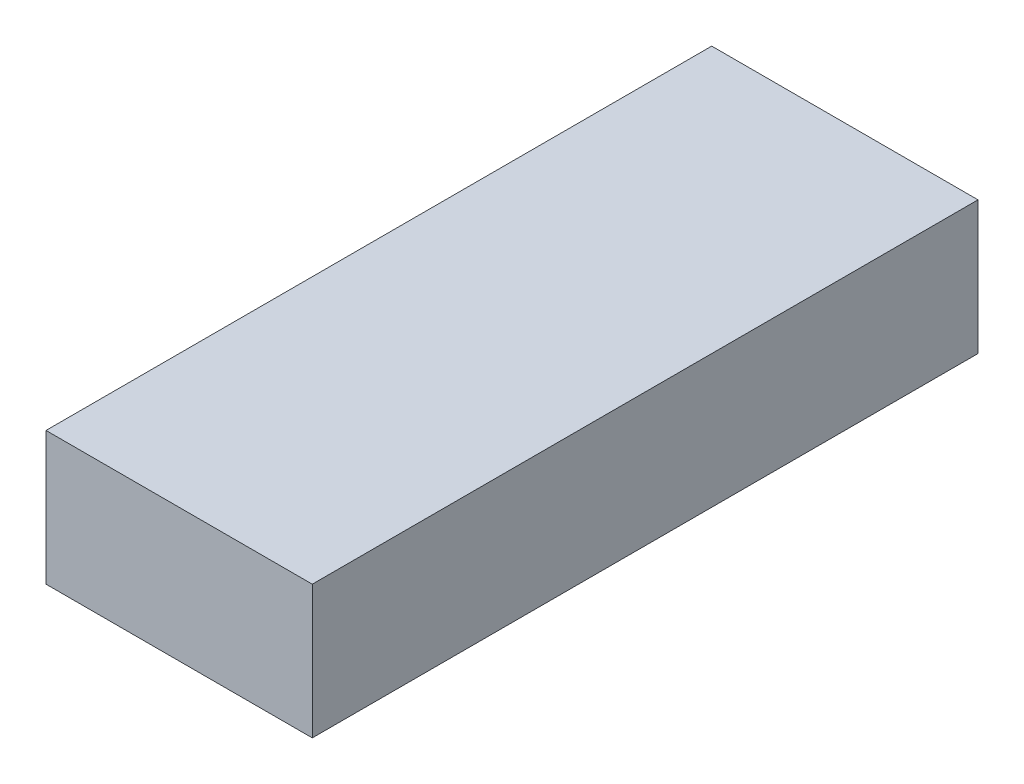
ISO-10303-21;
HEADER;
FILE_DESCRIPTION(('STEP AP214'),'2;1');
FILE_NAME('part.step','',(''),(''),'','','');
FILE_SCHEMA(('AUTOMOTIVE_DESIGN { 1 0 10303 214 1 1 1 1 }'));
ENDSEC;
DATA;
#1=APPLICATION_CONTEXT('core data for automotive mechanical design processes');
#2=APPLICATION_PROTOCOL_DEFINITION('international standard','automotive_design',2000,#1);
#3=PRODUCT_CONTEXT('',#1,'mechanical');
#4=PRODUCT('Part','Part','',(#3));
#5=PRODUCT_RELATED_PRODUCT_CATEGORY('part','',(#4));
#6=PRODUCT_DEFINITION_FORMATION('','',#4);
#7=PRODUCT_DEFINITION_CONTEXT('part definition',#1,'design');
#8=PRODUCT_DEFINITION('design','',#6,#7);
#9=PRODUCT_DEFINITION_SHAPE('','',#8);
#10=(LENGTH_UNIT() NAMED_UNIT(*) SI_UNIT(.MILLI.,.METRE.));
#11=(NAMED_UNIT(*) PLANE_ANGLE_UNIT() SI_UNIT($,.RADIAN.));
#12=(NAMED_UNIT(*) SI_UNIT($,.STERADIAN.) SOLID_ANGLE_UNIT());
#13=UNCERTAINTY_MEASURE_WITH_UNIT(LENGTH_MEASURE(1.E-05),#10,'distance_accuracy_value','');
#14=(GEOMETRIC_REPRESENTATION_CONTEXT(3) GLOBAL_UNCERTAINTY_ASSIGNED_CONTEXT((#13)) GLOBAL_UNIT_ASSIGNED_CONTEXT((#10,
#11,#12)) REPRESENTATION_CONTEXT('',''));
#15=CARTESIAN_POINT('',(0.,0.,0.));
#16=DIRECTION('',(0.,0.,1.));
#17=DIRECTION('',(1.,0.,0.));
#18=AXIS2_PLACEMENT_3D('',#15,#16,#17);
#19=CARTESIAN_POINT('',(-3.,-1.5,7.5));
#20=DIRECTION('',(1.,0.,0.));
#21=DIRECTION('',(0.,0.,-1.));
#22=AXIS2_PLACEMENT_3D('',#19,#20,#21);
#23=PLANE('',#22);
#24=DIRECTION('',(0.,-1.,0.));
#25=VECTOR('',#24,1.);
#26=CARTESIAN_POINT('',(-3.,-1.5,-7.5));
#27=LINE('',#26,#25);
#28=CARTESIAN_POINT('',(-3.,1.5,-7.5));
#29=VERTEX_POINT('',#28);
#30=CARTESIAN_POINT('',(-3.,-1.5,-7.5));
#31=VERTEX_POINT('',#30);
#32=EDGE_CURVE('E98',#29,#31,#27,.T.);
#33=ORIENTED_EDGE('',*,*,#32,.T.);
#34=DIRECTION('',(0.,0.,-1.));
#35=VECTOR('',#34,1.);
#36=CARTESIAN_POINT('',(-3.,-1.5,7.5));
#37=LINE('',#36,#35);
#38=CARTESIAN_POINT('',(-3.,-1.5,7.5));
#39=VERTEX_POINT('',#38);
#40=EDGE_CURVE('E11',#39,#31,#37,.T.);
#41=ORIENTED_EDGE('',*,*,#40,.F.);
#42=DIRECTION('',(0.,-1.,0.));
#43=VECTOR('',#42,1.);
#44=CARTESIAN_POINT('',(-3.,-1.5,7.5));
#45=LINE('',#44,#43);
#46=CARTESIAN_POINT('',(-3.,1.5,7.5));
#47=VERTEX_POINT('',#46);
#48=EDGE_CURVE('E86',#47,#39,#45,.T.);
#49=ORIENTED_EDGE('',*,*,#48,.F.);
#50=DIRECTION('',(0.,0.,-1.));
#51=VECTOR('',#50,1.);
#52=CARTESIAN_POINT('',(-3.,1.5,7.5));
#53=LINE('',#52,#51);
#54=EDGE_CURVE('E94',#47,#29,#53,.T.);
#55=ORIENTED_EDGE('',*,*,#54,.T.);
#56=EDGE_LOOP('',(#33,#41,#49,#55));
#57=FACE_BOUND('',#56,.T.);
#58=ADVANCED_FACE('F35',(#57),#23,.F.);
#59=CARTESIAN_POINT('',(3.,-1.5,7.5));
#60=DIRECTION('',(0.,1.,0.));
#61=DIRECTION('',(0.,0.,1.));
#62=AXIS2_PLACEMENT_3D('',#59,#60,#61);
#63=PLANE('',#62);
#64=DIRECTION('',(1.,0.,0.));
#65=VECTOR('',#64,1.);
#66=CARTESIAN_POINT('',(3.,-1.5,-7.5));
#67=LINE('',#66,#65);
#68=CARTESIAN_POINT('',(3.,-1.5,-7.5));
#69=VERTEX_POINT('',#68);
#70=EDGE_CURVE('E90',#31,#69,#67,.T.);
#71=ORIENTED_EDGE('',*,*,#70,.T.);
#72=DIRECTION('',(0.,0.,-1.));
#73=VECTOR('',#72,1.);
#74=CARTESIAN_POINT('',(3.,-1.5,7.5));
#75=LINE('',#74,#73);
#76=CARTESIAN_POINT('',(3.,-1.5,7.5));
#77=VERTEX_POINT('',#76);
#78=EDGE_CURVE('E43',#77,#69,#75,.T.);
#79=ORIENTED_EDGE('',*,*,#78,.F.);
#80=DIRECTION('',(1.,0.,0.));
#81=VECTOR('',#80,1.);
#82=CARTESIAN_POINT('',(3.,-1.5,7.5));
#83=LINE('',#82,#81);
#84=EDGE_CURVE('E81',#39,#77,#83,.T.);
#85=ORIENTED_EDGE('',*,*,#84,.F.);
#86=ORIENTED_EDGE('',*,*,#40,.T.);
#87=EDGE_LOOP('',(#71,#79,#85,#86));
#88=FACE_BOUND('',#87,.T.);
#89=ADVANCED_FACE('F89',(#88),#63,.F.);
#90=CARTESIAN_POINT('',(3.,-1.5,7.5));
#91=DIRECTION('',(-1.,0.,0.));
#92=DIRECTION('',(0.,0.,1.));
#93=AXIS2_PLACEMENT_3D('',#90,#91,#92);
#94=PLANE('',#93);
#95=DIRECTION('',(0.,1.,0.));
#96=VECTOR('',#95,1.);
#97=CARTESIAN_POINT('',(3.,-1.5,-7.5));
#98=LINE('',#97,#96);
#99=CARTESIAN_POINT('',(3.,1.5,-7.5));
#100=VERTEX_POINT('',#99);
#101=EDGE_CURVE('E68',#69,#100,#98,.T.);
#102=ORIENTED_EDGE('',*,*,#101,.T.);
#103=DIRECTION('',(0.,0.,-1.));
#104=VECTOR('',#103,1.);
#105=CARTESIAN_POINT('',(3.,1.5,7.5));
#106=LINE('',#105,#104);
#107=CARTESIAN_POINT('',(3.,1.5,7.5));
#108=VERTEX_POINT('',#107);
#109=EDGE_CURVE('E91',#108,#100,#106,.T.);
#110=ORIENTED_EDGE('',*,*,#109,.F.);
#111=DIRECTION('',(0.,1.,0.));
#112=VECTOR('',#111,1.);
#113=CARTESIAN_POINT('',(3.,-1.5,7.5));
#114=LINE('',#113,#112);
#115=EDGE_CURVE('E84',#77,#108,#114,.T.);
#116=ORIENTED_EDGE('',*,*,#115,.F.);
#117=ORIENTED_EDGE('',*,*,#78,.T.);
#118=EDGE_LOOP('',(#102,#110,#116,#117));
#119=FACE_BOUND('',#118,.T.);
#120=ADVANCED_FACE('F92',(#119),#94,.F.);
#121=CARTESIAN_POINT('',(3.,1.5,7.5));
#122=DIRECTION('',(0.,-1.,0.));
#123=DIRECTION('',(0.,0.,-1.));
#124=AXIS2_PLACEMENT_3D('',#121,#122,#123);
#125=PLANE('',#124);
#126=DIRECTION('',(-1.,0.,0.));
#127=VECTOR('',#126,1.);
#128=CARTESIAN_POINT('',(3.,1.5,-7.5));
#129=LINE('',#128,#127);
#130=EDGE_CURVE('E74',#100,#29,#129,.T.);
#131=ORIENTED_EDGE('',*,*,#130,.T.);
#132=ORIENTED_EDGE('',*,*,#54,.F.);
#133=DIRECTION('',(-1.,0.,0.));
#134=VECTOR('',#133,1.);
#135=CARTESIAN_POINT('',(3.,1.5,7.5));
#136=LINE('',#135,#134);
#137=EDGE_CURVE('E51',#108,#47,#136,.T.);
#138=ORIENTED_EDGE('',*,*,#137,.F.);
#139=ORIENTED_EDGE('',*,*,#109,.T.);
#140=EDGE_LOOP('',(#131,#132,#138,#139));
#141=FACE_BOUND('',#140,.T.);
#142=ADVANCED_FACE('F105',(#141),#125,.F.);
#143=CARTESIAN_POINT('',(0.,0.,7.5));
#144=DIRECTION('',(0.,0.,1.));
#145=DIRECTION('',(1.,0.,0.));
#146=AXIS2_PLACEMENT_3D('',#143,#144,#145);
#147=PLANE('',#146);
#148=ORIENTED_EDGE('',*,*,#48,.T.);
#149=ORIENTED_EDGE('',*,*,#84,.T.);
#150=ORIENTED_EDGE('',*,*,#115,.T.);
#151=ORIENTED_EDGE('',*,*,#137,.T.);
#152=EDGE_LOOP('',(#148,#149,#150,#151));
#153=FACE_BOUND('',#152,.T.);
#154=ADVANCED_FACE('F82',(#153),#147,.T.);
#155=CARTESIAN_POINT('',(0.,0.,-7.5));
#156=DIRECTION('',(0.,0.,1.));
#157=DIRECTION('',(1.,0.,0.));
#158=AXIS2_PLACEMENT_3D('',#155,#156,#157);
#159=PLANE('',#158);
#160=ORIENTED_EDGE('',*,*,#32,.F.);
#161=ORIENTED_EDGE('',*,*,#130,.F.);
#162=ORIENTED_EDGE('',*,*,#101,.F.);
#163=ORIENTED_EDGE('',*,*,#70,.F.);
#164=EDGE_LOOP('',(#160,#161,#162,#163));
#165=FACE_BOUND('',#164,.T.);
#166=ADVANCED_FACE('F108',(#165),#159,.F.);
#167=CLOSED_SHELL('',(#58,#89,#120,#142,#154,#166));
#168=MANIFOLD_SOLID_BREP('B2',#167);
#169=ADVANCED_BREP_SHAPE_REPRESENTATION('',(#18,#168),#14);
#170=SHAPE_DEFINITION_REPRESENTATION(#9,#169);
ENDSEC;
END-ISO-10303-21;
